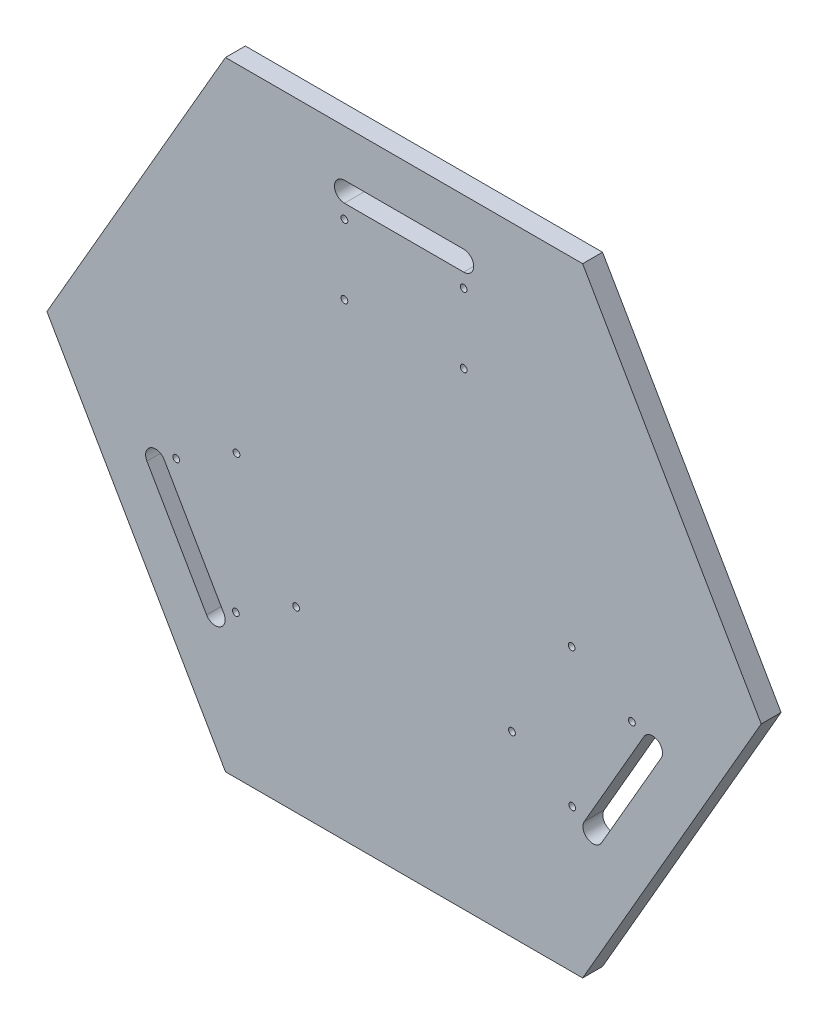
ISO-10303-21;
HEADER;
FILE_DESCRIPTION(('STEP AP214'),'2;1');
FILE_NAME('part.step','',(''),(''),'','','');
FILE_SCHEMA(('AUTOMOTIVE_DESIGN { 1 0 10303 214 1 1 1 1 }'));
ENDSEC;
DATA;
#1=APPLICATION_CONTEXT('core data for automotive mechanical design processes');
#2=APPLICATION_PROTOCOL_DEFINITION('international standard','automotive_design',2000,#1);
#3=PRODUCT_CONTEXT('',#1,'mechanical');
#4=PRODUCT('Part','Part','',(#3));
#5=PRODUCT_RELATED_PRODUCT_CATEGORY('part','',(#4));
#6=PRODUCT_DEFINITION_FORMATION('','',#4);
#7=PRODUCT_DEFINITION_CONTEXT('part definition',#1,'design');
#8=PRODUCT_DEFINITION('design','',#6,#7);
#9=PRODUCT_DEFINITION_SHAPE('','',#8);
#10=(LENGTH_UNIT() NAMED_UNIT(*) SI_UNIT(.MILLI.,.METRE.));
#11=(NAMED_UNIT(*) PLANE_ANGLE_UNIT() SI_UNIT($,.RADIAN.));
#12=(NAMED_UNIT(*) SI_UNIT($,.STERADIAN.) SOLID_ANGLE_UNIT());
#13=UNCERTAINTY_MEASURE_WITH_UNIT(LENGTH_MEASURE(1.E-05),#10,'distance_accuracy_value','');
#14=(GEOMETRIC_REPRESENTATION_CONTEXT(3) GLOBAL_UNCERTAINTY_ASSIGNED_CONTEXT((#13)) GLOBAL_UNIT_ASSIGNED_CONTEXT((#10,
#11,#12)) REPRESENTATION_CONTEXT('',''));
#15=CARTESIAN_POINT('',(0.,0.,0.));
#16=DIRECTION('',(0.,0.,1.));
#17=DIRECTION('',(1.,0.,0.));
#18=AXIS2_PLACEMENT_3D('',#15,#16,#17);
#19=CARTESIAN_POINT('',(89.8212681291761,155.575,5.));
#20=DIRECTION('',(0.,-1.,0.));
#21=DIRECTION('',(0.,0.,-1.));
#22=AXIS2_PLACEMENT_3D('',#19,#20,#21);
#23=PLANE('',#22);
#24=DIRECTION('',(-1.,0.,0.));
#25=VECTOR('',#24,1.);
#26=CARTESIAN_POINT('',(89.8212681291761,155.575,-5.));
#27=LINE('',#26,#25);
#28=CARTESIAN_POINT('',(89.8212681291761,155.575,-5.));
#29=VERTEX_POINT('',#28);
#30=CARTESIAN_POINT('',(-89.821268129176,155.575,-5.));
#31=VERTEX_POINT('',#30);
#32=EDGE_CURVE('E278',#29,#31,#27,.T.);
#33=ORIENTED_EDGE('',*,*,#32,.T.);
#34=DIRECTION('',(0.,0.,-1.));
#35=VECTOR('',#34,1.);
#36=CARTESIAN_POINT('',(-89.821268129176,155.575,5.));
#37=LINE('',#36,#35);
#38=CARTESIAN_POINT('',(-89.821268129176,155.575,5.));
#39=VERTEX_POINT('',#38);
#40=EDGE_CURVE('E11',#39,#31,#37,.T.);
#41=ORIENTED_EDGE('',*,*,#40,.F.);
#42=DIRECTION('',(-1.,0.,0.));
#43=VECTOR('',#42,1.);
#44=CARTESIAN_POINT('',(89.8212681291761,155.575,5.));
#45=LINE('',#44,#43);
#46=CARTESIAN_POINT('',(89.8212681291761,155.575,5.));
#47=VERTEX_POINT('',#46);
#48=EDGE_CURVE('E285',#47,#39,#45,.T.);
#49=ORIENTED_EDGE('',*,*,#48,.F.);
#50=DIRECTION('',(0.,0.,-1.));
#51=VECTOR('',#50,1.);
#52=CARTESIAN_POINT('',(89.8212681291761,155.575,5.));
#53=LINE('',#52,#51);
#54=EDGE_CURVE('E299',#47,#29,#53,.T.);
#55=ORIENTED_EDGE('',*,*,#54,.T.);
#56=EDGE_LOOP('',(#33,#41,#49,#55));
#57=FACE_BOUND('',#56,.T.);
#58=ADVANCED_FACE('F33',(#57),#23,.F.);
#59=CARTESIAN_POINT('',(-89.821268129176,155.575,5.));
#60=DIRECTION('',(0.866025403784439,-0.5,0.));
#61=DIRECTION('',(0.5,0.866025403784439,0.));
#62=AXIS2_PLACEMENT_3D('',#59,#60,#61);
#63=PLANE('',#62);
#64=DIRECTION('',(-0.5,-0.866025403784438,0.));
#65=VECTOR('',#64,1.);
#66=CARTESIAN_POINT('',(-89.821268129176,155.575,-5.));
#67=LINE('',#66,#65);
#68=CARTESIAN_POINT('',(-179.642536258352,0.,-5.));
#69=VERTEX_POINT('',#68);
#70=EDGE_CURVE('E302',#31,#69,#67,.T.);
#71=ORIENTED_EDGE('',*,*,#70,.T.);
#72=DIRECTION('',(0.,0.,-1.));
#73=VECTOR('',#72,1.);
#74=CARTESIAN_POINT('',(-179.642536258352,0.,5.));
#75=LINE('',#74,#73);
#76=CARTESIAN_POINT('',(-179.642536258352,0.,5.));
#77=VERTEX_POINT('',#76);
#78=EDGE_CURVE('E40',#77,#69,#75,.T.);
#79=ORIENTED_EDGE('',*,*,#78,.F.);
#80=DIRECTION('',(-0.5,-0.866025403784438,0.));
#81=VECTOR('',#80,1.);
#82=CARTESIAN_POINT('',(-89.821268129176,155.575,5.));
#83=LINE('',#82,#81);
#84=EDGE_CURVE('E288',#39,#77,#83,.T.);
#85=ORIENTED_EDGE('',*,*,#84,.F.);
#86=ORIENTED_EDGE('',*,*,#40,.T.);
#87=EDGE_LOOP('',(#71,#79,#85,#86));
#88=FACE_BOUND('',#87,.T.);
#89=ADVANCED_FACE('F348',(#88),#63,.F.);
#90=CARTESIAN_POINT('',(-179.642536258352,0.,5.));
#91=DIRECTION('',(0.866025403784439,0.5,0.));
#92=DIRECTION('',(-0.5,0.866025403784439,0.));
#93=AXIS2_PLACEMENT_3D('',#90,#91,#92);
#94=PLANE('',#93);
#95=DIRECTION('',(0.5,-0.866025403784439,0.));
#96=VECTOR('',#95,1.);
#97=CARTESIAN_POINT('',(-179.642536258352,0.,-5.));
#98=LINE('',#97,#96);
#99=CARTESIAN_POINT('',(-89.8212681291761,-155.575,-5.));
#100=VERTEX_POINT('',#99);
#101=EDGE_CURVE('E304',#69,#100,#98,.T.);
#102=ORIENTED_EDGE('',*,*,#101,.T.);
#103=DIRECTION('',(0.,0.,-1.));
#104=VECTOR('',#103,1.);
#105=CARTESIAN_POINT('',(-89.8212681291761,-155.575,5.));
#106=LINE('',#105,#104);
#107=CARTESIAN_POINT('',(-89.8212681291761,-155.575,5.));
#108=VERTEX_POINT('',#107);
#109=EDGE_CURVE('E319',#108,#100,#106,.T.);
#110=ORIENTED_EDGE('',*,*,#109,.F.);
#111=DIRECTION('',(0.5,-0.866025403784439,0.));
#112=VECTOR('',#111,1.);
#113=CARTESIAN_POINT('',(-179.642536258352,0.,5.));
#114=LINE('',#113,#112);
#115=EDGE_CURVE('E291',#77,#108,#114,.T.);
#116=ORIENTED_EDGE('',*,*,#115,.F.);
#117=ORIENTED_EDGE('',*,*,#78,.T.);
#118=EDGE_LOOP('',(#102,#110,#116,#117));
#119=FACE_BOUND('',#118,.T.);
#120=ADVANCED_FACE('F326',(#119),#94,.F.);
#121=CARTESIAN_POINT('',(-89.8212681291761,-155.575,5.));
#122=DIRECTION('',(0.,1.,0.));
#123=DIRECTION('',(0.,0.,1.));
#124=AXIS2_PLACEMENT_3D('',#121,#122,#123);
#125=PLANE('',#124);
#126=DIRECTION('',(1.,0.,0.));
#127=VECTOR('',#126,1.);
#128=CARTESIAN_POINT('',(-89.8212681291761,-155.575,-5.));
#129=LINE('',#128,#127);
#130=CARTESIAN_POINT('',(89.821268129176,-155.575,-5.));
#131=VERTEX_POINT('',#130);
#132=EDGE_CURVE('E306',#100,#131,#129,.T.);
#133=ORIENTED_EDGE('',*,*,#132,.T.);
#134=DIRECTION('',(0.,0.,-1.));
#135=VECTOR('',#134,1.);
#136=CARTESIAN_POINT('',(89.821268129176,-155.575,5.));
#137=LINE('',#136,#135);
#138=CARTESIAN_POINT('',(89.821268129176,-155.575,5.));
#139=VERTEX_POINT('',#138);
#140=EDGE_CURVE('E316',#139,#131,#137,.T.);
#141=ORIENTED_EDGE('',*,*,#140,.F.);
#142=DIRECTION('',(1.,0.,0.));
#143=VECTOR('',#142,1.);
#144=CARTESIAN_POINT('',(-89.8212681291761,-155.575,5.));
#145=LINE('',#144,#143);
#146=EDGE_CURVE('E293',#108,#139,#145,.T.);
#147=ORIENTED_EDGE('',*,*,#146,.F.);
#148=ORIENTED_EDGE('',*,*,#109,.T.);
#149=EDGE_LOOP('',(#133,#141,#147,#148));
#150=FACE_BOUND('',#149,.T.);
#151=ADVANCED_FACE('F336',(#150),#125,.F.);
#152=CARTESIAN_POINT('',(89.821268129176,-155.575,5.));
#153=DIRECTION('',(-0.866025403784439,0.5,0.));
#154=DIRECTION('',(-0.5,-0.866025403784439,0.));
#155=AXIS2_PLACEMENT_3D('',#152,#153,#154);
#156=PLANE('',#155);
#157=DIRECTION('',(0.5,0.866025403784439,0.));
#158=VECTOR('',#157,1.);
#159=CARTESIAN_POINT('',(89.821268129176,-155.575,-5.));
#160=LINE('',#159,#158);
#161=CARTESIAN_POINT('',(179.642536258352,0.,-5.));
#162=VERTEX_POINT('',#161);
#163=EDGE_CURVE('E308',#131,#162,#160,.T.);
#164=ORIENTED_EDGE('',*,*,#163,.T.);
#165=DIRECTION('',(0.,0.,-1.));
#166=VECTOR('',#165,1.);
#167=CARTESIAN_POINT('',(179.642536258352,0.,5.));
#168=LINE('',#167,#166);
#169=CARTESIAN_POINT('',(179.642536258352,0.,5.));
#170=VERTEX_POINT('',#169);
#171=EDGE_CURVE('E313',#170,#162,#168,.T.);
#172=ORIENTED_EDGE('',*,*,#171,.F.);
#173=DIRECTION('',(0.5,0.866025403784439,0.));
#174=VECTOR('',#173,1.);
#175=CARTESIAN_POINT('',(89.821268129176,-155.575,5.));
#176=LINE('',#175,#174);
#177=EDGE_CURVE('E295',#139,#170,#176,.T.);
#178=ORIENTED_EDGE('',*,*,#177,.F.);
#179=ORIENTED_EDGE('',*,*,#140,.T.);
#180=EDGE_LOOP('',(#164,#172,#178,#179));
#181=FACE_BOUND('',#180,.T.);
#182=ADVANCED_FACE('F340',(#181),#156,.F.);
#183=CARTESIAN_POINT('',(179.642536258352,0.,5.));
#184=DIRECTION('',(-0.866025403784439,-0.5,0.));
#185=DIRECTION('',(0.5,-0.866025403784439,0.));
#186=AXIS2_PLACEMENT_3D('',#183,#184,#185);
#187=PLANE('',#186);
#188=DIRECTION('',(-0.5,0.866025403784439,0.));
#189=VECTOR('',#188,1.);
#190=CARTESIAN_POINT('',(179.642536258352,0.,-5.));
#191=LINE('',#190,#189);
#192=EDGE_CURVE('E289',#162,#29,#191,.T.);
#193=ORIENTED_EDGE('',*,*,#192,.T.);
#194=ORIENTED_EDGE('',*,*,#54,.F.);
#195=DIRECTION('',(-0.5,0.866025403784439,0.));
#196=VECTOR('',#195,1.);
#197=CARTESIAN_POINT('',(179.642536258352,0.,5.));
#198=LINE('',#197,#196);
#199=EDGE_CURVE('E297',#170,#47,#198,.T.);
#200=ORIENTED_EDGE('',*,*,#199,.F.);
#201=ORIENTED_EDGE('',*,*,#171,.T.);
#202=EDGE_LOOP('',(#193,#194,#200,#201));
#203=FACE_BOUND('',#202,.T.);
#204=ADVANCED_FACE('F351',(#203),#187,.F.);
#205=CARTESIAN_POINT('',(0.,0.,5.));
#206=DIRECTION('',(0.,0.,1.));
#207=DIRECTION('',(1.,0.,0.));
#208=AXIS2_PLACEMENT_3D('',#205,#206,#207);
#209=PLANE('',#208);
#210=CARTESIAN_POINT('',(114.59292143557,-31.5192378858628,5.));
#211=DIRECTION('',(0.,0.,1.));
#212=DIRECTION('',(1.,0.,0.));
#213=AXIS2_PLACEMENT_3D('',#210,#211,#212);
#214=CIRCLE('',#213,1.69999999999999);
#215=CARTESIAN_POINT('',(116.29292143557,-31.5192378858628,5.));
#216=VERTEX_POINT('',#215);
#217=EDGE_CURVE('E643',#216,#216,#214,.T.);
#218=ORIENTED_EDGE('',*,*,#217,.F.);
#219=EDGE_LOOP('',(#218));
#220=FACE_BOUND('',#219,.T.);
#221=CARTESIAN_POINT('',(84.5929214348686,-83.4807621141449,5.));
#222=DIRECTION('',(0.,0.,1.));
#223=DIRECTION('',(1.,0.,0.));
#224=AXIS2_PLACEMENT_3D('',#221,#222,#223);
#225=CIRCLE('',#224,1.69999999999999);
#226=CARTESIAN_POINT('',(86.2929214348686,-83.4807621141449,5.));
#227=VERTEX_POINT('',#226);
#228=EDGE_CURVE('E645',#227,#227,#225,.T.);
#229=ORIENTED_EDGE('',*,*,#228,.F.);
#230=EDGE_LOOP('',(#229));
#231=FACE_BOUND('',#230,.T.);
#232=CARTESIAN_POINT('',(84.2820323031144,-14.0192378858631,5.));
#233=DIRECTION('',(0.,0.,1.));
#234=DIRECTION('',(1.,0.,0.));
#235=AXIS2_PLACEMENT_3D('',#232,#233,#234);
#236=CIRCLE('',#235,1.69999999999999);
#237=CARTESIAN_POINT('',(85.9820323031144,-14.0192378858631,5.));
#238=VERTEX_POINT('',#237);
#239=EDGE_CURVE('E653',#238,#238,#236,.T.);
#240=ORIENTED_EDGE('',*,*,#239,.F.);
#241=EDGE_LOOP('',(#240));
#242=FACE_BOUND('',#241,.T.);
#243=CARTESIAN_POINT('',(54.2820323024131,-65.9807621141452,5.));
#244=DIRECTION('',(0.,0.,1.));
#245=DIRECTION('',(1.,0.,0.));
#246=AXIS2_PLACEMENT_3D('',#243,#244,#245);
#247=CIRCLE('',#246,1.69999999999999);
#248=CARTESIAN_POINT('',(55.9820323024131,-65.9807621141452,5.));
#249=VERTEX_POINT('',#248);
#250=EDGE_CURVE('E659',#249,#249,#247,.T.);
#251=ORIENTED_EDGE('',*,*,#250,.F.);
#252=EDGE_LOOP('',(#251));
#253=FACE_BOUND('',#252,.T.);
#254=CARTESIAN_POINT('',(-84.5929214348674,-83.4807621141461,5.));
#255=DIRECTION('',(0.,0.,1.));
#256=DIRECTION('',(1.,0.,0.));
#257=AXIS2_PLACEMENT_3D('',#254,#255,#256);
#258=CIRCLE('',#257,1.69999999999999);
#259=CARTESIAN_POINT('',(-82.8929214348674,-83.4807621141461,5.));
#260=VERTEX_POINT('',#259);
#261=EDGE_CURVE('E665',#260,#260,#258,.T.);
#262=ORIENTED_EDGE('',*,*,#261,.F.);
#263=EDGE_LOOP('',(#262));
#264=FACE_BOUND('',#263,.T.);
#265=CARTESIAN_POINT('',(-114.592921435569,-31.5192378858644,5.));
#266=DIRECTION('',(0.,0.,1.));
#267=DIRECTION('',(1.,0.,0.));
#268=AXIS2_PLACEMENT_3D('',#265,#266,#267);
#269=CIRCLE('',#268,1.69999999999999);
#270=CARTESIAN_POINT('',(-112.892921435569,-31.5192378858644,5.));
#271=VERTEX_POINT('',#270);
#272=EDGE_CURVE('E671',#271,#271,#269,.T.);
#273=ORIENTED_EDGE('',*,*,#272,.F.);
#274=EDGE_LOOP('',(#273));
#275=FACE_BOUND('',#274,.T.);
#276=CARTESIAN_POINT('',(-54.2820323024122,-65.980762114146,5.));
#277=DIRECTION('',(0.,0.,1.));
#278=DIRECTION('',(1.,0.,0.));
#279=AXIS2_PLACEMENT_3D('',#276,#277,#278);
#280=CIRCLE('',#279,1.69999999999999);
#281=CARTESIAN_POINT('',(-52.5820323024122,-65.980762114146,5.));
#282=VERTEX_POINT('',#281);
#283=EDGE_CURVE('E677',#282,#282,#280,.T.);
#284=ORIENTED_EDGE('',*,*,#283,.F.);
#285=EDGE_LOOP('',(#284));
#286=FACE_BOUND('',#285,.T.);
#287=CARTESIAN_POINT('',(-84.2820323031142,-14.0192378858642,5.));
#288=DIRECTION('',(0.,0.,1.));
#289=DIRECTION('',(1.,0.,0.));
#290=AXIS2_PLACEMENT_3D('',#287,#288,#289);
#291=CIRCLE('',#290,1.69999999999999);
#292=CARTESIAN_POINT('',(-82.5820323031142,-14.0192378858642,5.));
#293=VERTEX_POINT('',#292);
#294=EDGE_CURVE('E682',#293,#293,#291,.T.);
#295=ORIENTED_EDGE('',*,*,#294,.F.);
#296=EDGE_LOOP('',(#295));
#297=FACE_BOUND('',#296,.T.);
#298=CARTESIAN_POINT('',(124.985226280281,-37.5192378870782,5.));
#299=DIRECTION('',(0.,0.,1.));
#300=DIRECTION('',(-0.499999999999992,-0.866025403784443,0.));
#301=AXIS2_PLACEMENT_3D('',#298,#299,#300);
#302=CIRCLE('',#301,5.00000000000952);
#303=CARTESIAN_POINT('',(129.315353299204,-40.0192378870782,5.));
#304=VERTEX_POINT('',#303);
#305=CARTESIAN_POINT('',(120.655099261343,-35.0192378870687,5.));
#306=VERTEX_POINT('',#305);
#307=EDGE_CURVE('E47',#304,#306,#302,.T.);
#308=ORIENTED_EDGE('',*,*,#307,.F.);
#309=DIRECTION('',(0.499999999999992,0.866025403784443,0.));
#310=VECTOR('',#309,1.);
#311=CARTESIAN_POINT('',(129.315353299204,-40.0192378870782,5.));
#312=LINE('',#311,#310);
#313=CARTESIAN_POINT('',(99.3153532992041,-91.9807621141448,5.));
#314=VERTEX_POINT('',#313);
#315=EDGE_CURVE('E175',#314,#304,#312,.T.);
#316=ORIENTED_EDGE('',*,*,#315,.F.);
#317=CARTESIAN_POINT('',(94.9852262802819,-89.4807621141448,5.));
#318=DIRECTION('',(0.,0.,1.));
#319=DIRECTION('',(-0.499999999999992,-0.866025403784443,0.));
#320=AXIS2_PLACEMENT_3D('',#317,#318,#319);
#321=CIRCLE('',#320,5.00000000000952);
#322=CARTESIAN_POINT('',(90.6550992613514,-86.9807621141401,5.));
#323=VERTEX_POINT('',#322);
#324=EDGE_CURVE('E178',#323,#314,#321,.T.);
#325=ORIENTED_EDGE('',*,*,#324,.F.);
#326=DIRECTION('',(-0.499999999999992,-0.866025403784443,0.));
#327=VECTOR('',#326,1.);
#328=CARTESIAN_POINT('',(120.655099261343,-35.0192378870687,5.));
#329=LINE('',#328,#327);
#330=EDGE_CURVE('E187',#306,#323,#329,.T.);
#331=ORIENTED_EDGE('',*,*,#330,.F.);
#332=EDGE_LOOP('',(#308,#316,#325,#331));
#333=FACE_BOUND('',#332,.T.);
#334=CARTESIAN_POINT('',(-94.9852262809825,-89.4807621129306,5.));
#335=DIRECTION('',(0.,0.,1.));
#336=DIRECTION('',(-0.500000000000004,0.866025403784436,0.));
#337=AXIS2_PLACEMENT_3D('',#334,#335,#336);
#338=CIRCLE('',#337,5.00000000000952);
#339=CARTESIAN_POINT('',(-99.3153532999046,-91.9807621129306,5.));
#340=VERTEX_POINT('',#339);
#341=CARTESIAN_POINT('',(-90.6550992620438,-86.9807621129211,5.));
#342=VERTEX_POINT('',#341);
#343=EDGE_CURVE('E193',#340,#342,#338,.T.);
#344=ORIENTED_EDGE('',*,*,#343,.F.);
#345=DIRECTION('',(0.500000000000004,-0.866025403784436,0.));
#346=VECTOR('',#345,1.);
#347=CARTESIAN_POINT('',(-99.3153532999046,-91.9807621129306,5.));
#348=LINE('',#347,#346);
#349=CARTESIAN_POINT('',(-129.315353299905,-40.0192378858644,5.));
#350=VERTEX_POINT('',#349);
#351=EDGE_CURVE('E201',#350,#340,#348,.T.);
#352=ORIENTED_EDGE('',*,*,#351,.F.);
#353=CARTESIAN_POINT('',(-124.985226280983,-37.5192378858644,5.));
#354=DIRECTION('',(0.,0.,1.));
#355=DIRECTION('',(-0.500000000000004,0.866025403784436,0.));
#356=AXIS2_PLACEMENT_3D('',#353,#354,#355);
#357=CIRCLE('',#356,5.00000000000952);
#358=CARTESIAN_POINT('',(-120.655099262052,-35.0192378858596,5.));
#359=VERTEX_POINT('',#358);
#360=EDGE_CURVE('E215',#359,#350,#357,.T.);
#361=ORIENTED_EDGE('',*,*,#360,.F.);
#362=DIRECTION('',(-0.500000000000004,0.866025403784436,0.));
#363=VECTOR('',#362,1.);
#364=CARTESIAN_POINT('',(-90.6550992620438,-86.9807621129211,5.));
#365=LINE('',#364,#363);
#366=EDGE_CURVE('E212',#342,#359,#365,.T.);
#367=ORIENTED_EDGE('',*,*,#366,.F.);
#368=EDGE_LOOP('',(#344,#352,#361,#367));
#369=FACE_BOUND('',#368,.T.);
#370=CARTESIAN_POINT('',(-30.0000000007018,115.00000000001,5.));
#371=DIRECTION('',(0.,0.,1.));
#372=DIRECTION('',(1.,0.,0.));
#373=AXIS2_PLACEMENT_3D('',#370,#371,#372);
#374=CIRCLE('',#373,1.69999999999999);
#375=CARTESIAN_POINT('',(-28.3000000007018,115.00000000001,5.));
#376=VERTEX_POINT('',#375);
#377=EDGE_CURVE('E222',#376,#376,#374,.T.);
#378=ORIENTED_EDGE('',*,*,#377,.F.);
#379=EDGE_LOOP('',(#378));
#380=FACE_BOUND('',#379,.T.);
#381=CARTESIAN_POINT('',(30.0000000007018,115.00000000001,5.));
#382=DIRECTION('',(0.,0.,1.));
#383=DIRECTION('',(1.,0.,0.));
#384=AXIS2_PLACEMENT_3D('',#381,#382,#383);
#385=CIRCLE('',#384,1.69999999999999);
#386=CARTESIAN_POINT('',(31.7000000007018,115.00000000001,5.));
#387=VERTEX_POINT('',#386);
#388=EDGE_CURVE('E234',#387,#387,#385,.T.);
#389=ORIENTED_EDGE('',*,*,#388,.F.);
#390=EDGE_LOOP('',(#389));
#391=FACE_BOUND('',#390,.T.);
#392=CARTESIAN_POINT('',(-30.0000000007018,80.0000000000095,5.));
#393=DIRECTION('',(0.,0.,1.));
#394=DIRECTION('',(1.,0.,0.));
#395=AXIS2_PLACEMENT_3D('',#392,#393,#394);
#396=CIRCLE('',#395,1.69999999999999);
#397=CARTESIAN_POINT('',(-28.3000000007018,80.0000000000095,5.));
#398=VERTEX_POINT('',#397);
#399=EDGE_CURVE('E240',#398,#398,#396,.T.);
#400=ORIENTED_EDGE('',*,*,#399,.F.);
#401=EDGE_LOOP('',(#400));
#402=FACE_BOUND('',#401,.T.);
#403=CARTESIAN_POINT('',(30.0000000007018,80.0000000000095,5.));
#404=DIRECTION('',(0.,0.,1.));
#405=DIRECTION('',(1.,0.,0.));
#406=AXIS2_PLACEMENT_3D('',#403,#404,#405);
#407=CIRCLE('',#406,1.69999999999999);
#408=CARTESIAN_POINT('',(31.7000000007018,80.0000000000095,5.));
#409=VERTEX_POINT('',#408);
#410=EDGE_CURVE('E246',#409,#409,#407,.T.);
#411=ORIENTED_EDGE('',*,*,#410,.F.);
#412=EDGE_LOOP('',(#411));
#413=FACE_BOUND('',#412,.T.);
#414=CARTESIAN_POINT('',(-29.9999999992982,127.00000000001,5.));
#415=DIRECTION('',(0.,0.,1.));
#416=DIRECTION('',(1.,0.,0.));
#417=AXIS2_PLACEMENT_3D('',#414,#415,#416);
#418=CIRCLE('',#417,5.00000000000952);
#419=CARTESIAN_POINT('',(-29.9999999992982,132.00000000001,5.));
#420=VERTEX_POINT('',#419);
#421=CARTESIAN_POINT('',(-29.9999999992982,121.99999999999,5.));
#422=VERTEX_POINT('',#421);
#423=EDGE_CURVE('E252',#420,#422,#418,.T.);
#424=ORIENTED_EDGE('',*,*,#423,.F.);
#425=DIRECTION('',(-1.,0.,0.));
#426=VECTOR('',#425,1.);
#427=CARTESIAN_POINT('',(-29.9999999992982,132.00000000001,5.));
#428=LINE('',#427,#426);
#429=CARTESIAN_POINT('',(30.0000000007018,132.00000000001,5.));
#430=VERTEX_POINT('',#429);
#431=EDGE_CURVE('E257',#430,#420,#428,.T.);
#432=ORIENTED_EDGE('',*,*,#431,.F.);
#433=CARTESIAN_POINT('',(30.0000000007018,127.00000000001,5.));
#434=DIRECTION('',(0.,0.,1.));
#435=DIRECTION('',(1.,0.,0.));
#436=AXIS2_PLACEMENT_3D('',#433,#434,#435);
#437=CIRCLE('',#436,5.00000000000952);
#438=CARTESIAN_POINT('',(30.0000000007018,122.,5.));
#439=VERTEX_POINT('',#438);
#440=EDGE_CURVE('E271',#439,#430,#437,.T.);
#441=ORIENTED_EDGE('',*,*,#440,.F.);
#442=DIRECTION('',(1.,0.,0.));
#443=VECTOR('',#442,1.);
#444=CARTESIAN_POINT('',(-29.9999999992982,121.99999999999,5.));
#445=LINE('',#444,#443);
#446=EDGE_CURVE('E268',#422,#439,#445,.T.);
#447=ORIENTED_EDGE('',*,*,#446,.F.);
#448=EDGE_LOOP('',(#424,#432,#441,#447));
#449=FACE_BOUND('',#448,.T.);
#450=ORIENTED_EDGE('',*,*,#48,.T.);
#451=ORIENTED_EDGE('',*,*,#84,.T.);
#452=ORIENTED_EDGE('',*,*,#115,.T.);
#453=ORIENTED_EDGE('',*,*,#146,.T.);
#454=ORIENTED_EDGE('',*,*,#177,.T.);
#455=ORIENTED_EDGE('',*,*,#199,.T.);
#456=EDGE_LOOP('',(#450,#451,#452,#453,#454,#455));
#457=FACE_BOUND('',#456,.T.);
#458=ADVANCED_FACE('F344',(#220,#231,#242,#253,#264,#275,#286,#297,#333,#369,#380,#391,#402,
#413,#449,#457),#209,.T.);
#459=CARTESIAN_POINT('',(0.,0.,-5.));
#460=DIRECTION('',(0.,0.,1.));
#461=DIRECTION('',(1.,0.,0.));
#462=AXIS2_PLACEMENT_3D('',#459,#460,#461);
#463=PLANE('',#462);
#464=CARTESIAN_POINT('',(114.59292143557,-31.5192378858628,-5.));
#465=DIRECTION('',(0.,0.,1.));
#466=DIRECTION('',(1.,0.,0.));
#467=AXIS2_PLACEMENT_3D('',#464,#465,#466);
#468=CIRCLE('',#467,1.69999999999999);
#469=CARTESIAN_POINT('',(116.29292143557,-31.5192378858628,-5.));
#470=VERTEX_POINT('',#469);
#471=EDGE_CURVE('E640',#470,#470,#468,.T.);
#472=ORIENTED_EDGE('',*,*,#471,.T.);
#473=EDGE_LOOP('',(#472));
#474=FACE_BOUND('',#473,.T.);
#475=CARTESIAN_POINT('',(84.5929214348686,-83.4807621141449,-5.));
#476=DIRECTION('',(0.,0.,1.));
#477=DIRECTION('',(1.,0.,0.));
#478=AXIS2_PLACEMENT_3D('',#475,#476,#477);
#479=CIRCLE('',#478,1.69999999999999);
#480=CARTESIAN_POINT('',(86.2929214348686,-83.4807621141449,-5.));
#481=VERTEX_POINT('',#480);
#482=EDGE_CURVE('E650',#481,#481,#479,.T.);
#483=ORIENTED_EDGE('',*,*,#482,.T.);
#484=EDGE_LOOP('',(#483));
#485=FACE_BOUND('',#484,.T.);
#486=CARTESIAN_POINT('',(84.2820323031144,-14.0192378858631,-5.));
#487=DIRECTION('',(0.,0.,1.));
#488=DIRECTION('',(1.,0.,0.));
#489=AXIS2_PLACEMENT_3D('',#486,#487,#488);
#490=CIRCLE('',#489,1.69999999999999);
#491=CARTESIAN_POINT('',(85.9820323031144,-14.0192378858631,-5.));
#492=VERTEX_POINT('',#491);
#493=EDGE_CURVE('E656',#492,#492,#490,.T.);
#494=ORIENTED_EDGE('',*,*,#493,.T.);
#495=EDGE_LOOP('',(#494));
#496=FACE_BOUND('',#495,.T.);
#497=CARTESIAN_POINT('',(54.2820323024131,-65.9807621141452,-5.));
#498=DIRECTION('',(0.,0.,1.));
#499=DIRECTION('',(1.,0.,0.));
#500=AXIS2_PLACEMENT_3D('',#497,#498,#499);
#501=CIRCLE('',#500,1.7);
#502=CARTESIAN_POINT('',(55.9820323024131,-65.9807621141452,-5.));
#503=VERTEX_POINT('',#502);
#504=EDGE_CURVE('E662',#503,#503,#501,.T.);
#505=ORIENTED_EDGE('',*,*,#504,.T.);
#506=EDGE_LOOP('',(#505));
#507=FACE_BOUND('',#506,.T.);
#508=CARTESIAN_POINT('',(-84.5929214348674,-83.4807621141461,-5.));
#509=DIRECTION('',(0.,0.,1.));
#510=DIRECTION('',(1.,0.,0.));
#511=AXIS2_PLACEMENT_3D('',#508,#509,#510);
#512=CIRCLE('',#511,1.69999999999999);
#513=CARTESIAN_POINT('',(-82.8929214348674,-83.4807621141461,-5.));
#514=VERTEX_POINT('',#513);
#515=EDGE_CURVE('E668',#514,#514,#512,.T.);
#516=ORIENTED_EDGE('',*,*,#515,.T.);
#517=EDGE_LOOP('',(#516));
#518=FACE_BOUND('',#517,.T.);
#519=CARTESIAN_POINT('',(-114.592921435569,-31.5192378858644,-5.));
#520=DIRECTION('',(0.,0.,1.));
#521=DIRECTION('',(1.,0.,0.));
#522=AXIS2_PLACEMENT_3D('',#519,#520,#521);
#523=CIRCLE('',#522,1.69999999999999);
#524=CARTESIAN_POINT('',(-112.892921435569,-31.5192378858644,-5.));
#525=VERTEX_POINT('',#524);
#526=EDGE_CURVE('E674',#525,#525,#523,.T.);
#527=ORIENTED_EDGE('',*,*,#526,.T.);
#528=EDGE_LOOP('',(#527));
#529=FACE_BOUND('',#528,.T.);
#530=CARTESIAN_POINT('',(-54.2820323024122,-65.980762114146,-5.));
#531=DIRECTION('',(0.,0.,1.));
#532=DIRECTION('',(1.,0.,0.));
#533=AXIS2_PLACEMENT_3D('',#530,#531,#532);
#534=CIRCLE('',#533,1.7);
#535=CARTESIAN_POINT('',(-52.5820323024122,-65.980762114146,-5.));
#536=VERTEX_POINT('',#535);
#537=EDGE_CURVE('E680',#536,#536,#534,.T.);
#538=ORIENTED_EDGE('',*,*,#537,.T.);
#539=EDGE_LOOP('',(#538));
#540=FACE_BOUND('',#539,.T.);
#541=CARTESIAN_POINT('',(-84.2820323031142,-14.0192378858642,-5.));
#542=DIRECTION('',(0.,0.,1.));
#543=DIRECTION('',(1.,0.,0.));
#544=AXIS2_PLACEMENT_3D('',#541,#542,#543);
#545=CIRCLE('',#544,1.69999999999999);
#546=CARTESIAN_POINT('',(-82.5820323031142,-14.0192378858642,-5.));
#547=VERTEX_POINT('',#546);
#548=EDGE_CURVE('E181',#547,#547,#545,.T.);
#549=ORIENTED_EDGE('',*,*,#548,.T.);
#550=EDGE_LOOP('',(#549));
#551=FACE_BOUND('',#550,.T.);
#552=DIRECTION('',(0.499999999999992,0.866025403784443,0.));
#553=VECTOR('',#552,1.);
#554=CARTESIAN_POINT('',(129.315353299204,-40.0192378870782,-5.));
#555=LINE('',#554,#553);
#556=CARTESIAN_POINT('',(99.3153532992041,-91.9807621141448,-5.));
#557=VERTEX_POINT('',#556);
#558=CARTESIAN_POINT('',(129.315353299204,-40.0192378870782,-5.));
#559=VERTEX_POINT('',#558);
#560=EDGE_CURVE('E165',#557,#559,#555,.T.);
#561=ORIENTED_EDGE('',*,*,#560,.T.);
#562=CARTESIAN_POINT('',(124.985226280281,-37.5192378870782,-5.));
#563=DIRECTION('',(0.,0.,1.));
#564=DIRECTION('',(-0.499999999999992,-0.866025403784443,0.));
#565=AXIS2_PLACEMENT_3D('',#562,#563,#564);
#566=CIRCLE('',#565,5.00000000000952);
#567=CARTESIAN_POINT('',(120.655099261343,-35.0192378870687,-5.));
#568=VERTEX_POINT('',#567);
#569=EDGE_CURVE('E159',#559,#568,#566,.T.);
#570=ORIENTED_EDGE('',*,*,#569,.T.);
#571=DIRECTION('',(-0.499999999999992,-0.866025403784443,0.));
#572=VECTOR('',#571,1.);
#573=CARTESIAN_POINT('',(120.655099261343,-35.0192378870687,-5.));
#574=LINE('',#573,#572);
#575=CARTESIAN_POINT('',(90.6550992613404,-86.9807621141401,-5.));
#576=VERTEX_POINT('',#575);
#577=EDGE_CURVE('E168',#568,#576,#574,.T.);
#578=ORIENTED_EDGE('',*,*,#577,.T.);
#579=CARTESIAN_POINT('',(94.9852262802819,-89.4807621141448,-5.));
#580=DIRECTION('',(0.,0.,1.));
#581=DIRECTION('',(-0.499999999999992,-0.866025403784443,0.));
#582=AXIS2_PLACEMENT_3D('',#579,#580,#581);
#583=CIRCLE('',#582,5.00000000000952);
#584=EDGE_CURVE('E55',#576,#557,#583,.T.);
#585=ORIENTED_EDGE('',*,*,#584,.T.);
#586=EDGE_LOOP('',(#561,#570,#578,#585));
#587=FACE_BOUND('',#586,.T.);
#588=DIRECTION('',(0.500000000000004,-0.866025403784436,0.));
#589=VECTOR('',#588,1.);
#590=CARTESIAN_POINT('',(-99.3153532999046,-91.9807621129306,-5.));
#591=LINE('',#590,#589);
#592=CARTESIAN_POINT('',(-129.315353299905,-40.0192378858644,-5.));
#593=VERTEX_POINT('',#592);
#594=CARTESIAN_POINT('',(-99.3153532999046,-91.9807621129306,-5.));
#595=VERTEX_POINT('',#594);
#596=EDGE_CURVE('E207',#593,#595,#591,.T.);
#597=ORIENTED_EDGE('',*,*,#596,.T.);
#598=CARTESIAN_POINT('',(-94.9852262809825,-89.4807621129306,-5.));
#599=DIRECTION('',(0.,0.,1.));
#600=DIRECTION('',(-0.500000000000004,0.866025403784436,0.));
#601=AXIS2_PLACEMENT_3D('',#598,#599,#600);
#602=CIRCLE('',#601,5.00000000000952);
#603=CARTESIAN_POINT('',(-90.6550992620438,-86.9807621129211,-5.));
#604=VERTEX_POINT('',#603);
#605=EDGE_CURVE('E197',#595,#604,#602,.T.);
#606=ORIENTED_EDGE('',*,*,#605,.T.);
#607=DIRECTION('',(-0.500000000000004,0.866025403784436,0.));
#608=VECTOR('',#607,1.);
#609=CARTESIAN_POINT('',(-90.6550992620438,-86.9807621129211,-5.));
#610=LINE('',#609,#608);
#611=CARTESIAN_POINT('',(-120.655099262041,-35.0192378858596,-5.));
#612=VERTEX_POINT('',#611);
#613=EDGE_CURVE('E200',#604,#612,#610,.T.);
#614=ORIENTED_EDGE('',*,*,#613,.T.);
#615=CARTESIAN_POINT('',(-124.985226280983,-37.5192378858644,-5.));
#616=DIRECTION('',(0.,0.,1.));
#617=DIRECTION('',(-0.500000000000004,0.866025403784436,0.));
#618=AXIS2_PLACEMENT_3D('',#615,#616,#617);
#619=CIRCLE('',#618,5.00000000000952);
#620=EDGE_CURVE('E204',#612,#593,#619,.T.);
#621=ORIENTED_EDGE('',*,*,#620,.T.);
#622=EDGE_LOOP('',(#597,#606,#614,#621));
#623=FACE_BOUND('',#622,.T.);
#624=CARTESIAN_POINT('',(-30.0000000007018,115.00000000001,-5.));
#625=DIRECTION('',(0.,0.,1.));
#626=DIRECTION('',(1.,0.,0.));
#627=AXIS2_PLACEMENT_3D('',#624,#625,#626);
#628=CIRCLE('',#627,1.7);
#629=CARTESIAN_POINT('',(-28.3000000007018,115.00000000001,-5.));
#630=VERTEX_POINT('',#629);
#631=EDGE_CURVE('E231',#630,#630,#628,.T.);
#632=ORIENTED_EDGE('',*,*,#631,.T.);
#633=EDGE_LOOP('',(#632));
#634=FACE_BOUND('',#633,.T.);
#635=CARTESIAN_POINT('',(30.0000000007018,115.00000000001,-5.));
#636=DIRECTION('',(0.,0.,1.));
#637=DIRECTION('',(1.,0.,0.));
#638=AXIS2_PLACEMENT_3D('',#635,#636,#637);
#639=CIRCLE('',#638,1.7);
#640=CARTESIAN_POINT('',(31.7000000007018,115.00000000001,-5.));
#641=VERTEX_POINT('',#640);
#642=EDGE_CURVE('E237',#641,#641,#639,.T.);
#643=ORIENTED_EDGE('',*,*,#642,.T.);
#644=EDGE_LOOP('',(#643));
#645=FACE_BOUND('',#644,.T.);
#646=CARTESIAN_POINT('',(-30.0000000007018,80.0000000000095,-5.));
#647=DIRECTION('',(0.,0.,1.));
#648=DIRECTION('',(1.,0.,0.));
#649=AXIS2_PLACEMENT_3D('',#646,#647,#648);
#650=CIRCLE('',#649,1.7);
#651=CARTESIAN_POINT('',(-28.3000000007018,80.0000000000095,-5.));
#652=VERTEX_POINT('',#651);
#653=EDGE_CURVE('E243',#652,#652,#650,.T.);
#654=ORIENTED_EDGE('',*,*,#653,.T.);
#655=EDGE_LOOP('',(#654));
#656=FACE_BOUND('',#655,.T.);
#657=CARTESIAN_POINT('',(30.0000000007018,80.0000000000095,-5.));
#658=DIRECTION('',(0.,0.,1.));
#659=DIRECTION('',(1.,0.,0.));
#660=AXIS2_PLACEMENT_3D('',#657,#658,#659);
#661=CIRCLE('',#660,1.7);
#662=CARTESIAN_POINT('',(31.7000000007018,80.0000000000095,-5.));
#663=VERTEX_POINT('',#662);
#664=EDGE_CURVE('E249',#663,#663,#661,.T.);
#665=ORIENTED_EDGE('',*,*,#664,.T.);
#666=EDGE_LOOP('',(#665));
#667=FACE_BOUND('',#666,.T.);
#668=DIRECTION('',(-1.,0.,0.));
#669=VECTOR('',#668,1.);
#670=CARTESIAN_POINT('',(-29.9999999992982,132.00000000001,-5.));
#671=LINE('',#670,#669);
#672=CARTESIAN_POINT('',(30.0000000007018,132.00000000001,-5.));
#673=VERTEX_POINT('',#672);
#674=CARTESIAN_POINT('',(-29.9999999992982,132.00000000001,-5.));
#675=VERTEX_POINT('',#674);
#676=EDGE_CURVE('E263',#673,#675,#671,.T.);
#677=ORIENTED_EDGE('',*,*,#676,.T.);
#678=CARTESIAN_POINT('',(-29.9999999992982,127.00000000001,-5.));
#679=DIRECTION('',(0.,0.,1.));
#680=DIRECTION('',(1.,0.,0.));
#681=AXIS2_PLACEMENT_3D('',#678,#679,#680);
#682=CIRCLE('',#681,5.00000000000952);
#683=CARTESIAN_POINT('',(-29.9999999992982,121.99999999999,-5.));
#684=VERTEX_POINT('',#683);
#685=EDGE_CURVE('E253',#675,#684,#682,.T.);
#686=ORIENTED_EDGE('',*,*,#685,.T.);
#687=DIRECTION('',(1.,0.,0.));
#688=VECTOR('',#687,1.);
#689=CARTESIAN_POINT('',(-29.9999999992982,121.99999999999,-5.));
#690=LINE('',#689,#688);
#691=CARTESIAN_POINT('',(30.0000000007018,121.99999999999,-5.));
#692=VERTEX_POINT('',#691);
#693=EDGE_CURVE('E256',#684,#692,#690,.T.);
#694=ORIENTED_EDGE('',*,*,#693,.T.);
#695=CARTESIAN_POINT('',(30.0000000007018,127.00000000001,-5.));
#696=DIRECTION('',(0.,0.,1.));
#697=DIRECTION('',(1.,0.,0.));
#698=AXIS2_PLACEMENT_3D('',#695,#696,#697);
#699=CIRCLE('',#698,5.00000000000952);
#700=EDGE_CURVE('E260',#692,#673,#699,.T.);
#701=ORIENTED_EDGE('',*,*,#700,.T.);
#702=EDGE_LOOP('',(#677,#686,#694,#701));
#703=FACE_BOUND('',#702,.T.);
#704=ORIENTED_EDGE('',*,*,#32,.F.);
#705=ORIENTED_EDGE('',*,*,#192,.F.);
#706=ORIENTED_EDGE('',*,*,#163,.F.);
#707=ORIENTED_EDGE('',*,*,#132,.F.);
#708=ORIENTED_EDGE('',*,*,#101,.F.);
#709=ORIENTED_EDGE('',*,*,#70,.F.);
#710=EDGE_LOOP('',(#704,#705,#706,#707,#708,#709));
#711=FACE_BOUND('',#710,.T.);
#712=ADVANCED_FACE('F172',(#474,#485,#496,#507,#518,#529,#540,#551,#587,#623,#634,#645,#656,
#667,#703,#711),#463,.F.);
#713=CARTESIAN_POINT('',(-29.9999999992982,127.00000000001,-5.));
#714=DIRECTION('',(0.,0.,1.));
#715=DIRECTION('',(1.,0.,0.));
#716=AXIS2_PLACEMENT_3D('',#713,#714,#715);
#717=CYLINDRICAL_SURFACE('',#716,5.00000000000952);
#718=ORIENTED_EDGE('',*,*,#423,.T.);
#719=DIRECTION('',(0.,0.,1.));
#720=VECTOR('',#719,1.);
#721=CARTESIAN_POINT('',(-29.9999999992982,121.99999999999,-5.));
#722=LINE('',#721,#720);
#723=EDGE_CURVE('E266',#684,#422,#722,.T.);
#724=ORIENTED_EDGE('',*,*,#723,.F.);
#725=ORIENTED_EDGE('',*,*,#685,.F.);
#726=DIRECTION('',(0.,0.,1.));
#727=VECTOR('',#726,1.);
#728=CARTESIAN_POINT('',(-29.9999999992982,132.00000000001,-5.));
#729=LINE('',#728,#727);
#730=EDGE_CURVE('E276',#675,#420,#729,.T.);
#731=ORIENTED_EDGE('',*,*,#730,.T.);
#732=EDGE_LOOP('',(#718,#724,#725,#731));
#733=FACE_BOUND('',#732,.T.);
#734=ADVANCED_FACE('F390',(#733),#717,.F.);
#735=CARTESIAN_POINT('',(-29.9999999992982,132.00000000001,-5.));
#736=DIRECTION('',(0.,1.,0.));
#737=DIRECTION('',(0.,0.,1.));
#738=AXIS2_PLACEMENT_3D('',#735,#736,#737);
#739=PLANE('',#738);
#740=ORIENTED_EDGE('',*,*,#431,.T.);
#741=ORIENTED_EDGE('',*,*,#730,.F.);
#742=ORIENTED_EDGE('',*,*,#676,.F.);
#743=DIRECTION('',(0.,0.,1.));
#744=VECTOR('',#743,1.);
#745=CARTESIAN_POINT('',(30.0000000007018,132.00000000001,-5.));
#746=LINE('',#745,#744);
#747=EDGE_CURVE('E279',#673,#430,#746,.T.);
#748=ORIENTED_EDGE('',*,*,#747,.T.);
#749=EDGE_LOOP('',(#740,#741,#742,#748));
#750=FACE_BOUND('',#749,.T.);
#751=ADVANCED_FACE('F395',(#750),#739,.F.);
#752=CARTESIAN_POINT('',(30.0000000007018,127.00000000001,-5.));
#753=DIRECTION('',(0.,0.,1.));
#754=DIRECTION('',(1.,0.,0.));
#755=AXIS2_PLACEMENT_3D('',#752,#753,#754);
#756=CYLINDRICAL_SURFACE('',#755,5.00000000000952);
#757=ORIENTED_EDGE('',*,*,#440,.T.);
#758=ORIENTED_EDGE('',*,*,#747,.F.);
#759=ORIENTED_EDGE('',*,*,#700,.F.);
#760=DIRECTION('',(0.,0.,1.));
#761=VECTOR('',#760,1.);
#762=CARTESIAN_POINT('',(30.0000000007018,122.,-5.));
#763=LINE('',#762,#761);
#764=EDGE_CURVE('E281',#692,#439,#763,.T.);
#765=ORIENTED_EDGE('',*,*,#764,.T.);
#766=EDGE_LOOP('',(#757,#758,#759,#765));
#767=FACE_BOUND('',#766,.T.);
#768=ADVANCED_FACE('F407',(#767),#756,.F.);
#769=CARTESIAN_POINT('',(-29.9999999992982,121.99999999999,-5.));
#770=DIRECTION('',(0.,-1.,0.));
#771=DIRECTION('',(0.,0.,-1.));
#772=AXIS2_PLACEMENT_3D('',#769,#770,#771);
#773=PLANE('',#772);
#774=ORIENTED_EDGE('',*,*,#446,.T.);
#775=ORIENTED_EDGE('',*,*,#764,.F.);
#776=ORIENTED_EDGE('',*,*,#693,.F.);
#777=ORIENTED_EDGE('',*,*,#723,.T.);
#778=EDGE_LOOP('',(#774,#775,#776,#777));
#779=FACE_BOUND('',#778,.T.);
#780=ADVANCED_FACE('F417',(#779),#773,.F.);
#781=CARTESIAN_POINT('',(30.0000000007018,80.0000000000095,5.));
#782=DIRECTION('',(0.,0.,1.));
#783=DIRECTION('',(1.,0.,0.));
#784=AXIS2_PLACEMENT_3D('',#781,#782,#783);
#785=CYLINDRICAL_SURFACE('',#784,1.69999999999999);
#786=ORIENTED_EDGE('',*,*,#664,.F.);
#787=EDGE_LOOP('',(#786));
#788=FACE_BOUND('',#787,.T.);
#789=ORIENTED_EDGE('',*,*,#410,.T.);
#790=EDGE_LOOP('',(#789));
#791=FACE_BOUND('',#790,.T.);
#792=ADVANCED_FACE('F427',(#788,#791),#785,.F.);
#793=CARTESIAN_POINT('',(-30.0000000007018,80.0000000000095,5.));
#794=DIRECTION('',(0.,0.,1.));
#795=DIRECTION('',(1.,0.,0.));
#796=AXIS2_PLACEMENT_3D('',#793,#794,#795);
#797=CYLINDRICAL_SURFACE('',#796,1.69999999999999);
#798=ORIENTED_EDGE('',*,*,#653,.F.);
#799=EDGE_LOOP('',(#798));
#800=FACE_BOUND('',#799,.T.);
#801=ORIENTED_EDGE('',*,*,#399,.T.);
#802=EDGE_LOOP('',(#801));
#803=FACE_BOUND('',#802,.T.);
#804=ADVANCED_FACE('F437',(#800,#803),#797,.F.);
#805=CARTESIAN_POINT('',(30.0000000007018,115.00000000001,5.));
#806=DIRECTION('',(0.,0.,1.));
#807=DIRECTION('',(1.,0.,0.));
#808=AXIS2_PLACEMENT_3D('',#805,#806,#807);
#809=CYLINDRICAL_SURFACE('',#808,1.69999999999999);
#810=ORIENTED_EDGE('',*,*,#642,.F.);
#811=EDGE_LOOP('',(#810));
#812=FACE_BOUND('',#811,.T.);
#813=ORIENTED_EDGE('',*,*,#388,.T.);
#814=EDGE_LOOP('',(#813));
#815=FACE_BOUND('',#814,.T.);
#816=ADVANCED_FACE('F447',(#812,#815),#809,.F.);
#817=CARTESIAN_POINT('',(-30.0000000007018,115.00000000001,5.));
#818=DIRECTION('',(0.,0.,1.));
#819=DIRECTION('',(1.,0.,0.));
#820=AXIS2_PLACEMENT_3D('',#817,#818,#819);
#821=CYLINDRICAL_SURFACE('',#820,1.69999999999999);
#822=ORIENTED_EDGE('',*,*,#631,.F.);
#823=EDGE_LOOP('',(#822));
#824=FACE_BOUND('',#823,.T.);
#825=ORIENTED_EDGE('',*,*,#377,.T.);
#826=EDGE_LOOP('',(#825));
#827=FACE_BOUND('',#826,.T.);
#828=ADVANCED_FACE('F457',(#824,#827),#821,.F.);
#829=CARTESIAN_POINT('',(-94.9852262809825,-89.4807621129306,-5.));
#830=DIRECTION('',(0.,0.,1.));
#831=DIRECTION('',(1.,0.,0.));
#832=AXIS2_PLACEMENT_3D('',#829,#830,#831);
#833=CYLINDRICAL_SURFACE('',#832,5.00000000000952);
#834=ORIENTED_EDGE('',*,*,#343,.T.);
#835=DIRECTION('',(0.,0.,1.));
#836=VECTOR('',#835,1.);
#837=CARTESIAN_POINT('',(-90.6550992620438,-86.9807621129211,-5.));
#838=LINE('',#837,#836);
#839=EDGE_CURVE('E210',#604,#342,#838,.T.);
#840=ORIENTED_EDGE('',*,*,#839,.F.);
#841=ORIENTED_EDGE('',*,*,#605,.F.);
#842=DIRECTION('',(0.,0.,1.));
#843=VECTOR('',#842,1.);
#844=CARTESIAN_POINT('',(-99.3153532999046,-91.9807621129306,-5.));
#845=LINE('',#844,#843);
#846=EDGE_CURVE('E220',#595,#340,#845,.T.);
#847=ORIENTED_EDGE('',*,*,#846,.T.);
#848=EDGE_LOOP('',(#834,#840,#841,#847));
#849=FACE_BOUND('',#848,.T.);
#850=ADVANCED_FACE('F467',(#849),#833,.F.);
#851=CARTESIAN_POINT('',(-99.3153532999046,-91.9807621129306,-5.));
#852=DIRECTION('',(-0.866025403784436,-0.500000000000004,0.));
#853=DIRECTION('',(0.500000000000004,-0.866025403784436,0.));
#854=AXIS2_PLACEMENT_3D('',#851,#852,#853);
#855=PLANE('',#854);
#856=ORIENTED_EDGE('',*,*,#351,.T.);
#857=ORIENTED_EDGE('',*,*,#846,.F.);
#858=ORIENTED_EDGE('',*,*,#596,.F.);
#859=DIRECTION('',(0.,0.,1.));
#860=VECTOR('',#859,1.);
#861=CARTESIAN_POINT('',(-129.315353299905,-40.0192378858644,-5.));
#862=LINE('',#861,#860);
#863=EDGE_CURVE('E223',#593,#350,#862,.T.);
#864=ORIENTED_EDGE('',*,*,#863,.T.);
#865=EDGE_LOOP('',(#856,#857,#858,#864));
#866=FACE_BOUND('',#865,.T.);
#867=ADVANCED_FACE('F488',(#866),#855,.F.);
#868=CARTESIAN_POINT('',(-124.985226280983,-37.5192378858644,-5.));
#869=DIRECTION('',(0.,0.,1.));
#870=DIRECTION('',(1.,0.,0.));
#871=AXIS2_PLACEMENT_3D('',#868,#869,#870);
#872=CYLINDRICAL_SURFACE('',#871,5.00000000000952);
#873=ORIENTED_EDGE('',*,*,#360,.T.);
#874=ORIENTED_EDGE('',*,*,#863,.F.);
#875=ORIENTED_EDGE('',*,*,#620,.F.);
#876=DIRECTION('',(0.,0.,1.));
#877=VECTOR('',#876,1.);
#878=CARTESIAN_POINT('',(-120.655099262052,-35.0192378858596,-5.));
#879=LINE('',#878,#877);
#880=EDGE_CURVE('E225',#612,#359,#879,.T.);
#881=ORIENTED_EDGE('',*,*,#880,.T.);
#882=EDGE_LOOP('',(#873,#874,#875,#881));
#883=FACE_BOUND('',#882,.T.);
#884=ADVANCED_FACE('F498',(#883),#872,.F.);
#885=CARTESIAN_POINT('',(-90.6550992620438,-86.9807621129211,-5.));
#886=DIRECTION('',(0.866025403784436,0.500000000000004,0.));
#887=DIRECTION('',(-0.500000000000004,0.866025403784436,0.));
#888=AXIS2_PLACEMENT_3D('',#885,#886,#887);
#889=PLANE('',#888);
#890=ORIENTED_EDGE('',*,*,#366,.T.);
#891=ORIENTED_EDGE('',*,*,#880,.F.);
#892=ORIENTED_EDGE('',*,*,#613,.F.);
#893=ORIENTED_EDGE('',*,*,#839,.T.);
#894=EDGE_LOOP('',(#890,#891,#892,#893));
#895=FACE_BOUND('',#894,.T.);
#896=ADVANCED_FACE('F508',(#895),#889,.F.);
#897=CARTESIAN_POINT('',(124.985226280281,-37.5192378870782,-5.));
#898=DIRECTION('',(0.,0.,1.));
#899=DIRECTION('',(1.,0.,0.));
#900=AXIS2_PLACEMENT_3D('',#897,#898,#899);
#901=CYLINDRICAL_SURFACE('',#900,5.00000000000952);
#902=ORIENTED_EDGE('',*,*,#307,.T.);
#903=DIRECTION('',(0.,0.,1.));
#904=VECTOR('',#903,1.);
#905=CARTESIAN_POINT('',(120.655099261343,-35.0192378870687,-5.));
#906=LINE('',#905,#904);
#907=EDGE_CURVE('E155',#568,#306,#906,.T.);
#908=ORIENTED_EDGE('',*,*,#907,.F.);
#909=ORIENTED_EDGE('',*,*,#569,.F.);
#910=DIRECTION('',(0.,0.,1.));
#911=VECTOR('',#910,1.);
#912=CARTESIAN_POINT('',(129.315353299204,-40.0192378870782,-5.));
#913=LINE('',#912,#911);
#914=EDGE_CURVE('E191',#559,#304,#913,.T.);
#915=ORIENTED_EDGE('',*,*,#914,.T.);
#916=EDGE_LOOP('',(#902,#908,#909,#915));
#917=FACE_BOUND('',#916,.T.);
#918=ADVANCED_FACE('F157',(#917),#901,.F.);
#919=CARTESIAN_POINT('',(129.315353299204,-40.0192378870782,-5.));
#920=DIRECTION('',(0.866025403784443,-0.499999999999992,0.));
#921=DIRECTION('',(0.499999999999992,0.866025403784443,0.));
#922=AXIS2_PLACEMENT_3D('',#919,#920,#921);
#923=PLANE('',#922);
#924=ORIENTED_EDGE('',*,*,#315,.T.);
#925=ORIENTED_EDGE('',*,*,#914,.F.);
#926=ORIENTED_EDGE('',*,*,#560,.F.);
#927=DIRECTION('',(0.,0.,1.));
#928=VECTOR('',#927,1.);
#929=CARTESIAN_POINT('',(99.3153532992041,-91.9807621141448,-5.));
#930=LINE('',#929,#928);
#931=EDGE_CURVE('E194',#557,#314,#930,.T.);
#932=ORIENTED_EDGE('',*,*,#931,.T.);
#933=EDGE_LOOP('',(#924,#925,#926,#932));
#934=FACE_BOUND('',#933,.T.);
#935=ADVANCED_FACE('F527',(#934),#923,.F.);
#936=CARTESIAN_POINT('',(94.9852262802819,-89.4807621141448,-5.));
#937=DIRECTION('',(0.,0.,1.));
#938=DIRECTION('',(1.,0.,0.));
#939=AXIS2_PLACEMENT_3D('',#936,#937,#938);
#940=CYLINDRICAL_SURFACE('',#939,5.00000000000952);
#941=ORIENTED_EDGE('',*,*,#324,.T.);
#942=ORIENTED_EDGE('',*,*,#931,.F.);
#943=ORIENTED_EDGE('',*,*,#584,.F.);
#944=DIRECTION('',(0.,0.,1.));
#945=VECTOR('',#944,1.);
#946=CARTESIAN_POINT('',(90.6550992613514,-86.9807621141401,-5.));
#947=LINE('',#946,#945);
#948=EDGE_CURVE('E164',#576,#323,#947,.T.);
#949=ORIENTED_EDGE('',*,*,#948,.T.);
#950=EDGE_LOOP('',(#941,#942,#943,#949));
#951=FACE_BOUND('',#950,.T.);
#952=ADVANCED_FACE('F536',(#951),#940,.F.);
#953=CARTESIAN_POINT('',(120.655099261343,-35.0192378870687,-5.));
#954=DIRECTION('',(-0.866025403784443,0.499999999999992,0.));
#955=DIRECTION('',(-0.499999999999992,-0.866025403784443,0.));
#956=AXIS2_PLACEMENT_3D('',#953,#954,#955);
#957=PLANE('',#956);
#958=ORIENTED_EDGE('',*,*,#330,.T.);
#959=ORIENTED_EDGE('',*,*,#948,.F.);
#960=ORIENTED_EDGE('',*,*,#577,.F.);
#961=ORIENTED_EDGE('',*,*,#907,.T.);
#962=EDGE_LOOP('',(#958,#959,#960,#961));
#963=FACE_BOUND('',#962,.T.);
#964=ADVANCED_FACE('F169',(#963),#957,.F.);
#965=CARTESIAN_POINT('',(-84.2820323031142,-14.0192378858642,5.));
#966=DIRECTION('',(0.,0.,1.));
#967=DIRECTION('',(1.,0.,0.));
#968=AXIS2_PLACEMENT_3D('',#965,#966,#967);
#969=CYLINDRICAL_SURFACE('',#968,1.69999999999999);
#970=ORIENTED_EDGE('',*,*,#548,.F.);
#971=EDGE_LOOP('',(#970));
#972=FACE_BOUND('',#971,.T.);
#973=ORIENTED_EDGE('',*,*,#294,.T.);
#974=EDGE_LOOP('',(#973));
#975=FACE_BOUND('',#974,.T.);
#976=ADVANCED_FACE('F554',(#972,#975),#969,.F.);
#977=CARTESIAN_POINT('',(-54.2820323024122,-65.980762114146,5.));
#978=DIRECTION('',(0.,0.,1.));
#979=DIRECTION('',(1.,0.,0.));
#980=AXIS2_PLACEMENT_3D('',#977,#978,#979);
#981=CYLINDRICAL_SURFACE('',#980,1.69999999999999);
#982=ORIENTED_EDGE('',*,*,#537,.F.);
#983=EDGE_LOOP('',(#982));
#984=FACE_BOUND('',#983,.T.);
#985=ORIENTED_EDGE('',*,*,#283,.T.);
#986=EDGE_LOOP('',(#985));
#987=FACE_BOUND('',#986,.T.);
#988=ADVANCED_FACE('F563',(#984,#987),#981,.F.);
#989=CARTESIAN_POINT('',(-114.592921435569,-31.5192378858644,5.));
#990=DIRECTION('',(0.,0.,1.));
#991=DIRECTION('',(1.,0.,0.));
#992=AXIS2_PLACEMENT_3D('',#989,#990,#991);
#993=CYLINDRICAL_SURFACE('',#992,1.69999999999999);
#994=ORIENTED_EDGE('',*,*,#526,.F.);
#995=EDGE_LOOP('',(#994));
#996=FACE_BOUND('',#995,.T.);
#997=ORIENTED_EDGE('',*,*,#272,.T.);
#998=EDGE_LOOP('',(#997));
#999=FACE_BOUND('',#998,.T.);
#1000=ADVANCED_FACE('F573',(#996,#999),#993,.F.);
#1001=CARTESIAN_POINT('',(-84.5929214348674,-83.4807621141461,5.));
#1002=DIRECTION('',(0.,0.,1.));
#1003=DIRECTION('',(1.,0.,0.));
#1004=AXIS2_PLACEMENT_3D('',#1001,#1002,#1003);
#1005=CYLINDRICAL_SURFACE('',#1004,1.69999999999999);
#1006=ORIENTED_EDGE('',*,*,#515,.F.);
#1007=EDGE_LOOP('',(#1006));
#1008=FACE_BOUND('',#1007,.T.);
#1009=ORIENTED_EDGE('',*,*,#261,.T.);
#1010=EDGE_LOOP('',(#1009));
#1011=FACE_BOUND('',#1010,.T.);
#1012=ADVANCED_FACE('F583',(#1008,#1011),#1005,.F.);
#1013=CARTESIAN_POINT('',(54.2820323024131,-65.9807621141452,5.));
#1014=DIRECTION('',(0.,0.,1.));
#1015=DIRECTION('',(1.,0.,0.));
#1016=AXIS2_PLACEMENT_3D('',#1013,#1014,#1015);
#1017=CYLINDRICAL_SURFACE('',#1016,1.69999999999999);
#1018=ORIENTED_EDGE('',*,*,#504,.F.);
#1019=EDGE_LOOP('',(#1018));
#1020=FACE_BOUND('',#1019,.T.);
#1021=ORIENTED_EDGE('',*,*,#250,.T.);
#1022=EDGE_LOOP('',(#1021));
#1023=FACE_BOUND('',#1022,.T.);
#1024=ADVANCED_FACE('F593',(#1020,#1023),#1017,.F.);
#1025=CARTESIAN_POINT('',(84.2820323031144,-14.0192378858631,5.));
#1026=DIRECTION('',(0.,0.,1.));
#1027=DIRECTION('',(1.,0.,0.));
#1028=AXIS2_PLACEMENT_3D('',#1025,#1026,#1027);
#1029=CYLINDRICAL_SURFACE('',#1028,1.69999999999999);
#1030=ORIENTED_EDGE('',*,*,#493,.F.);
#1031=EDGE_LOOP('',(#1030));
#1032=FACE_BOUND('',#1031,.T.);
#1033=ORIENTED_EDGE('',*,*,#239,.T.);
#1034=EDGE_LOOP('',(#1033));
#1035=FACE_BOUND('',#1034,.T.);
#1036=ADVANCED_FACE('F603',(#1032,#1035),#1029,.F.);
#1037=CARTESIAN_POINT('',(84.5929214348686,-83.4807621141449,5.));
#1038=DIRECTION('',(0.,0.,1.));
#1039=DIRECTION('',(1.,0.,0.));
#1040=AXIS2_PLACEMENT_3D('',#1037,#1038,#1039);
#1041=CYLINDRICAL_SURFACE('',#1040,1.69999999999999);
#1042=ORIENTED_EDGE('',*,*,#482,.F.);
#1043=EDGE_LOOP('',(#1042));
#1044=FACE_BOUND('',#1043,.T.);
#1045=ORIENTED_EDGE('',*,*,#228,.T.);
#1046=EDGE_LOOP('',(#1045));
#1047=FACE_BOUND('',#1046,.T.);
#1048=ADVANCED_FACE('F613',(#1044,#1047),#1041,.F.);
#1049=CARTESIAN_POINT('',(114.59292143557,-31.5192378858628,5.));
#1050=DIRECTION('',(0.,0.,1.));
#1051=DIRECTION('',(1.,0.,0.));
#1052=AXIS2_PLACEMENT_3D('',#1049,#1050,#1051);
#1053=CYLINDRICAL_SURFACE('',#1052,1.69999999999999);
#1054=ORIENTED_EDGE('',*,*,#471,.F.);
#1055=EDGE_LOOP('',(#1054));
#1056=FACE_BOUND('',#1055,.T.);
#1057=ORIENTED_EDGE('',*,*,#217,.T.);
#1058=EDGE_LOOP('',(#1057));
#1059=FACE_BOUND('',#1058,.T.);
#1060=ADVANCED_FACE('F623',(#1056,#1059),#1053,.F.);
#1061=CLOSED_SHELL('',(#58,#89,#120,#151,#182,#204,#458,#712,#734,#751,#768,#780,#792,#804,#816,
#828,#850,#867,#884,#896,#918,#935,#952,#964,#976,#988,#1000,#1012,#1024,#1036,#1048,#1060));
#1062=MANIFOLD_SOLID_BREP('B2',#1061);
#1063=ADVANCED_BREP_SHAPE_REPRESENTATION('',(#18,#1062),#14);
#1064=SHAPE_DEFINITION_REPRESENTATION(#9,#1063);
ENDSEC;
END-ISO-10303-21;
